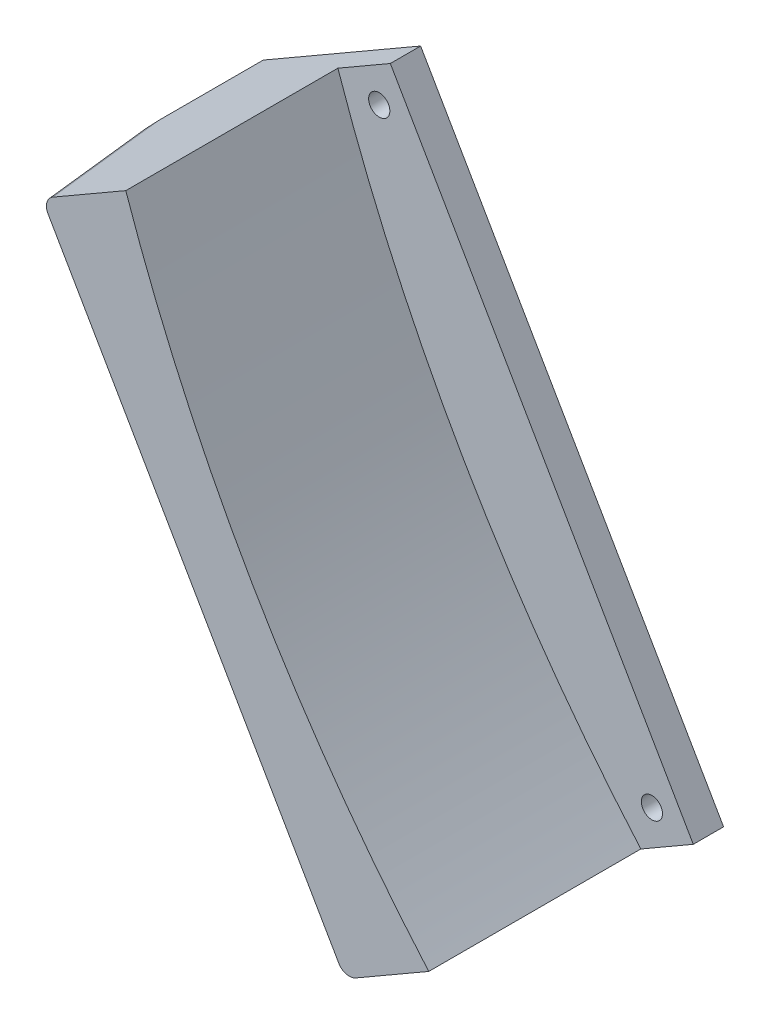
ISO-10303-21;
HEADER;
FILE_DESCRIPTION(('STEP AP214'),'2;1');
FILE_NAME('part.step','',(''),(''),'','','');
FILE_SCHEMA(('AUTOMOTIVE_DESIGN { 1 0 10303 214 1 1 1 1 }'));
ENDSEC;
DATA;
#1=APPLICATION_CONTEXT('core data for automotive mechanical design processes');
#2=APPLICATION_PROTOCOL_DEFINITION('international standard','automotive_design',2000,#1);
#3=PRODUCT_CONTEXT('',#1,'mechanical');
#4=PRODUCT('Part','Part','',(#3));
#5=PRODUCT_RELATED_PRODUCT_CATEGORY('part','',(#4));
#6=PRODUCT_DEFINITION_FORMATION('','',#4);
#7=PRODUCT_DEFINITION_CONTEXT('part definition',#1,'design');
#8=PRODUCT_DEFINITION('design','',#6,#7);
#9=PRODUCT_DEFINITION_SHAPE('','',#8);
#10=(LENGTH_UNIT() NAMED_UNIT(*) SI_UNIT(.MILLI.,.METRE.));
#11=(NAMED_UNIT(*) PLANE_ANGLE_UNIT() SI_UNIT($,.RADIAN.));
#12=(NAMED_UNIT(*) SI_UNIT($,.STERADIAN.) SOLID_ANGLE_UNIT());
#13=UNCERTAINTY_MEASURE_WITH_UNIT(LENGTH_MEASURE(1.E-05),#10,'distance_accuracy_value','');
#14=(GEOMETRIC_REPRESENTATION_CONTEXT(3) GLOBAL_UNCERTAINTY_ASSIGNED_CONTEXT((#13)) GLOBAL_UNIT_ASSIGNED_CONTEXT((#10,
#11,#12)) REPRESENTATION_CONTEXT('',''));
#15=CARTESIAN_POINT('',(0.,0.,0.));
#16=DIRECTION('',(0.,0.,1.));
#17=DIRECTION('',(1.,0.,0.));
#18=AXIS2_PLACEMENT_3D('',#15,#16,#17);
#19=CARTESIAN_POINT('',(124.70765814496,71.9999999999997,20.));
#20=DIRECTION('',(0.,0.,-1.));
#21=DIRECTION('',(-1.,0.,0.));
#22=AXIS2_PLACEMENT_3D('',#19,#20,#21);
#23=CYLINDRICAL_SURFACE('',#22,262.5);
#24=DIRECTION('',(0.,0.,-1.));
#25=VECTOR('',#24,1.);
#26=CARTESIAN_POINT('',(-73.4619802469967,-100.148320989783,20.));
#27=LINE('',#26,#25);
#28=CARTESIAN_POINT('',(-73.4619802469967,-100.148320989783,20.));
#29=VERTEX_POINT('',#28);
#30=CARTESIAN_POINT('',(-73.4619802469967,-100.148320989783,-15.));
#31=VERTEX_POINT('',#30);
#32=EDGE_CURVE('E209',#29,#31,#27,.T.);
#33=ORIENTED_EDGE('',*,*,#32,.T.);
#34=CARTESIAN_POINT('',(124.70765814496,71.9999999999997,-15.));
#35=DIRECTION('',(0.,0.,-1.));
#36=DIRECTION('',(-1.,0.,0.));
#37=AXIS2_PLACEMENT_3D('',#34,#35,#36);
#38=CIRCLE('',#37,262.5);
#39=CARTESIAN_POINT('',(-123.461980247008,-13.5457806113193,-15.));
#40=VERTEX_POINT('',#39);
#41=EDGE_CURVE('E170',#40,#31,#38,.F.);
#42=ORIENTED_EDGE('',*,*,#41,.F.);
#43=DIRECTION('',(0.,0.,-1.));
#44=VECTOR('',#43,1.);
#45=CARTESIAN_POINT('',(-123.461980247008,-13.5457806113193,20.));
#46=LINE('',#45,#44);
#47=CARTESIAN_POINT('',(-123.461980247008,-13.5457806113193,20.));
#48=VERTEX_POINT('',#47);
#49=EDGE_CURVE('E218',#48,#40,#46,.T.);
#50=ORIENTED_EDGE('',*,*,#49,.F.);
#51=CARTESIAN_POINT('',(124.70765814496,71.9999999999997,20.));
#52=DIRECTION('',(0.,0.,1.));
#53=DIRECTION('',(1.,0.,0.));
#54=AXIS2_PLACEMENT_3D('',#51,#52,#53);
#55=CIRCLE('',#54,262.5);
#56=EDGE_CURVE('E197',#48,#29,#55,.T.);
#57=ORIENTED_EDGE('',*,*,#56,.T.);
#58=EDGE_LOOP('',(#33,#42,#50,#57));
#59=FACE_BOUND('',#58,.T.);
#60=ADVANCED_FACE('F71',(#59),#23,.F.);
#61=CARTESIAN_POINT('',(-25.0000000000509,43.3012701892647,20.));
#62=DIRECTION('',(0.500000000000394,-0.866025403784211,0.));
#63=DIRECTION('',(0.866025403784211,0.500000000000394,0.));
#64=AXIS2_PLACEMENT_3D('',#61,#62,#63);
#65=PLANE('',#64);
#66=DIRECTION('',(0.,0.,-1.));
#67=VECTOR('',#66,1.);
#68=CARTESIAN_POINT('',(-140.782488322695,-23.5457806113285,20.));
#69=LINE('',#68,#67);
#70=CARTESIAN_POINT('',(-140.782488322695,-23.5457806113285,-2.72740661030927));
#71=VERTEX_POINT('',#70);
#72=CARTESIAN_POINT('',(-140.782488322695,-23.5457806113285,-20.));
#73=VERTEX_POINT('',#72);
#74=EDGE_CURVE('E215',#71,#73,#69,.T.);
#75=ORIENTED_EDGE('',*,*,#74,.F.);
#76=DIRECTION('',(0.224143868041953,0.129409522551361,0.965925826289069));
#77=VECTOR('',#76,1.);
#78=CARTESIAN_POINT('',(-135.628693601688,-20.5702358418041,19.4823619097952));
#79=LINE('',#78,#77);
#80=CARTESIAN_POINT('',(-135.508575264828,-20.5008854876831,20.));
#81=VERTEX_POINT('',#80);
#82=EDGE_CURVE('E228',#71,#81,#79,.T.);
#83=ORIENTED_EDGE('',*,*,#82,.T.);
#84=DIRECTION('',(-0.866025403784211,-0.500000000000394,0.));
#85=VECTOR('',#84,1.);
#86=CARTESIAN_POINT('',(-25.0000000000509,43.3012701892647,20.));
#87=LINE('',#86,#85);
#88=EDGE_CURVE('E201',#48,#81,#87,.T.);
#89=ORIENTED_EDGE('',*,*,#88,.F.);
#90=ORIENTED_EDGE('',*,*,#49,.T.);
#91=DIRECTION('',(0.866025403784211,0.500000000000394,0.));
#92=VECTOR('',#91,1.);
#93=CARTESIAN_POINT('',(-87.499943068542,7.21691123429726,-15.));
#94=LINE('',#93,#92);
#95=CARTESIAN_POINT('',(-114.801726209168,-8.54578061131624,-15.));
#96=VERTEX_POINT('',#95);
#97=EDGE_CURVE('E165',#40,#96,#94,.T.);
#98=ORIENTED_EDGE('',*,*,#97,.T.);
#99=DIRECTION('',(0.,0.,1.));
#100=VECTOR('',#99,1.);
#101=CARTESIAN_POINT('',(-114.801726209168,-8.54578061131624,-20.));
#102=LINE('',#101,#100);
#103=CARTESIAN_POINT('',(-114.801726209168,-8.54578061131624,-20.));
#104=VERTEX_POINT('',#103);
#105=EDGE_CURVE('E162',#104,#96,#102,.T.);
#106=ORIENTED_EDGE('',*,*,#105,.F.);
#107=DIRECTION('',(0.866025403784211,0.500000000000394,0.));
#108=VECTOR('',#107,1.);
#109=CARTESIAN_POINT('',(-87.499943068542,7.21691123429726,-20.));
#110=LINE('',#109,#108);
#111=EDGE_CURVE('E146',#73,#104,#110,.T.);
#112=ORIENTED_EDGE('',*,*,#111,.F.);
#113=EDGE_LOOP('',(#75,#83,#89,#90,#98,#106,#112));
#114=FACE_BOUND('',#113,.T.);
#115=ADVANCED_FACE('F163',(#114),#65,.F.);
#116=CARTESIAN_POINT('',(-115.782488322694,-66.8470508005519,20.));
#117=DIRECTION('',(0.866025403784439,0.5,0.));
#118=DIRECTION('',(-0.5,0.866025403784439,0.));
#119=AXIS2_PLACEMENT_3D('',#116,#117,#118);
#120=PLANE('',#119);
#121=DIRECTION('',(-0.5,0.866025403784439,0.));
#122=VECTOR('',#121,1.);
#123=CARTESIAN_POINT('',(-140.782488322695,-23.5457806113285,4.9999999999998));
#124=LINE('',#123,#122);
#125=CARTESIAN_POINT('',(-91.782488322694,-108.416270182205,4.9999999999998));
#126=VERTEX_POINT('',#125);
#127=CARTESIAN_POINT('',(-139.782488322695,-25.2778314188966,4.9999999999998));
#128=VERTEX_POINT('',#127);
#129=EDGE_CURVE('E225',#126,#128,#124,.T.);
#130=ORIENTED_EDGE('',*,*,#129,.T.);
#131=CARTESIAN_POINT('',(-139.782488322695,-25.2778314188974,-2.72740661031277));
#132=DIRECTION('',(0.866025403784439,0.5,0.));
#133=DIRECTION('',(0.,-1.05562035583231E-13,-1.));
#134=AXIS2_PLACEMENT_3D('',#131,#132,#133);
#135=ELLIPSE('',#134,7.72740661031261,2.);
#136=EDGE_CURVE('E80',#128,#71,#135,.F.);
#137=ORIENTED_EDGE('',*,*,#136,.T.);
#138=ORIENTED_EDGE('',*,*,#74,.T.);
#139=DIRECTION('',(-0.5,0.866025403784439,0.));
#140=VECTOR('',#139,1.);
#141=CARTESIAN_POINT('',(-115.928602318722,-66.5939739357341,-20.));
#142=LINE('',#141,#140);
#143=CARTESIAN_POINT('',(-90.7824883226946,-110.148320989772,-20.));
#144=VERTEX_POINT('',#143);
#145=EDGE_CURVE('E155',#144,#73,#142,.T.);
#146=ORIENTED_EDGE('',*,*,#145,.F.);
#147=DIRECTION('',(0.,0.,-1.));
#148=VECTOR('',#147,1.);
#149=CARTESIAN_POINT('',(-90.7824883226946,-110.148320989772,20.));
#150=LINE('',#149,#148);
#151=CARTESIAN_POINT('',(-90.7824883226946,-110.148320989772,-2.72740661030766));
#152=VERTEX_POINT('',#151);
#153=EDGE_CURVE('E212',#152,#144,#150,.T.);
#154=ORIENTED_EDGE('',*,*,#153,.F.);
#155=CARTESIAN_POINT('',(-91.7824883226946,-108.416270182203,-2.72740661031279));
#156=DIRECTION('',(0.866025403784439,0.5,0.));
#157=DIRECTION('',(0.,1.59139372360859E-13,-1.));
#158=AXIS2_PLACEMENT_3D('',#155,#156,#157);
#159=ELLIPSE('',#158,7.72740661031261,2.);
#160=EDGE_CURVE('E87',#152,#126,#159,.F.);
#161=ORIENTED_EDGE('',*,*,#160,.T.);
#162=EDGE_LOOP('',(#130,#137,#138,#146,#154,#161));
#163=FACE_BOUND('',#162,.T.);
#164=ADVANCED_FACE('F247',(#163),#120,.F.);
#165=CARTESIAN_POINT('',(25.0000000000153,-43.301270189317,20.));
#166=DIRECTION('',(0.499999999999406,-0.866025403784782,0.));
#167=DIRECTION('',(0.866025403784782,0.499999999999406,0.));
#168=AXIS2_PLACEMENT_3D('',#165,#166,#167);
#169=PLANE('',#168);
#170=DIRECTION('',(-0.866025403784782,-0.499999999999406,0.));
#171=VECTOR('',#170,1.);
#172=CARTESIAN_POINT('',(25.0000000000153,-43.301270189317,20.));
#173=LINE('',#172,#171);
#174=CARTESIAN_POINT('',(-85.5085752648245,-107.103425866133,20.));
#175=VERTEX_POINT('',#174);
#176=EDGE_CURVE('E205',#29,#175,#173,.T.);
#177=ORIENTED_EDGE('',*,*,#176,.T.);
#178=DIRECTION('',(-0.2241438680421,-0.129409522551106,-0.965925826289069));
#179=VECTOR('',#178,1.);
#180=CARTESIAN_POINT('',(-78.1059043900927,-102.829491843891,51.9010778384458));
#181=LINE('',#180,#179);
#182=EDGE_CURVE('E12',#175,#152,#181,.T.);
#183=ORIENTED_EDGE('',*,*,#182,.T.);
#184=ORIENTED_EDGE('',*,*,#153,.T.);
#185=DIRECTION('',(0.866025403784782,0.499999999999406,0.));
#186=VECTOR('',#185,1.);
#187=CARTESIAN_POINT('',(-37.4999430685172,-79.3856291442133,-20.));
#188=LINE('',#187,#186);
#189=CARTESIAN_POINT('',(-64.8017262091504,-95.1483209897897,-20.));
#190=VERTEX_POINT('',#189);
#191=EDGE_CURVE('E176',#144,#190,#188,.T.);
#192=ORIENTED_EDGE('',*,*,#191,.T.);
#193=DIRECTION('',(0.,0.,1.));
#194=VECTOR('',#193,1.);
#195=CARTESIAN_POINT('',(-64.8017262091504,-95.1483209897897,-20.));
#196=LINE('',#195,#194);
#197=CARTESIAN_POINT('',(-64.8017262091504,-95.1483209897897,-15.));
#198=VERTEX_POINT('',#197);
#199=EDGE_CURVE('E171',#190,#198,#196,.T.);
#200=ORIENTED_EDGE('',*,*,#199,.T.);
#201=DIRECTION('',(0.866025403784782,0.499999999999406,0.));
#202=VECTOR('',#201,1.);
#203=CARTESIAN_POINT('',(-37.4999430685172,-79.3856291442133,-15.));
#204=LINE('',#203,#202);
#205=EDGE_CURVE('E159',#31,#198,#204,.T.);
#206=ORIENTED_EDGE('',*,*,#205,.F.);
#207=ORIENTED_EDGE('',*,*,#32,.F.);
#208=EDGE_LOOP('',(#177,#183,#184,#192,#200,#206,#207));
#209=FACE_BOUND('',#208,.T.);
#210=ADVANCED_FACE('F259',(#209),#169,.T.);
#211=CARTESIAN_POINT('',(0.,0.,20.));
#212=DIRECTION('',(0.,0.,1.));
#213=DIRECTION('',(1.,0.,0.));
#214=AXIS2_PLACEMENT_3D('',#211,#212,#213);
#215=PLANE('',#214);
#216=ORIENTED_EDGE('',*,*,#88,.T.);
#217=CARTESIAN_POINT('',(-134.508575264827,-22.2329362952515,20.));
#218=DIRECTION('',(0.,0.,1.));
#219=DIRECTION('',(-0.866025403784211,-0.500000000000394,0.));
#220=AXIS2_PLACEMENT_3D('',#217,#218,#219);
#221=ELLIPSE('',#220,2.07055236082016,2.);
#222=CARTESIAN_POINT('',(-136.301726209163,-23.2682124756616,20.));
#223=VERTEX_POINT('',#222);
#224=EDGE_CURVE('E235',#81,#223,#221,.T.);
#225=ORIENTED_EDGE('',*,*,#224,.T.);
#226=DIRECTION('',(0.5,-0.866025403784439,0.));
#227=VECTOR('',#226,1.);
#228=CARTESIAN_POINT('',(-87.3017262091615,-108.138702046539,20.));
#229=LINE('',#228,#227);
#230=CARTESIAN_POINT('',(-88.3017262091594,-106.406651238974,20.));
#231=VERTEX_POINT('',#230);
#232=EDGE_CURVE('E221',#223,#231,#229,.T.);
#233=ORIENTED_EDGE('',*,*,#232,.T.);
#234=CARTESIAN_POINT('',(-86.5085752648233,-105.371375058564,20.));
#235=DIRECTION('',(0.,0.,1.));
#236=DIRECTION('',(-0.866025403784782,-0.499999999999406,0.));
#237=AXIS2_PLACEMENT_3D('',#234,#235,#236);
#238=ELLIPSE('',#237,2.07055236082016,2.);
#239=EDGE_CURVE('E232',#231,#175,#238,.T.);
#240=ORIENTED_EDGE('',*,*,#239,.T.);
#241=ORIENTED_EDGE('',*,*,#176,.F.);
#242=ORIENTED_EDGE('',*,*,#56,.F.);
#243=EDGE_LOOP('',(#216,#225,#233,#240,#241,#242));
#244=FACE_BOUND('',#243,.T.);
#245=ADVANCED_FACE('F253',(#244),#215,.T.);
#246=CARTESIAN_POINT('',(0.,0.,-15.));
#247=DIRECTION('',(0.,0.,1.));
#248=DIRECTION('',(0.,-1.,0.));
#249=AXIS2_PLACEMENT_3D('',#246,#247,#248);
#250=PLANE('',#249);
#251=CARTESIAN_POINT('',(-71.6318532280829,-93.3181939708497,-15.));
#252=DIRECTION('',(0.,0.,-1.));
#253=DIRECTION('',(-1.,0.,0.));
#254=AXIS2_PLACEMENT_3D('',#251,#252,#253);
#255=CIRCLE('',#254,1.75);
#256=CARTESIAN_POINT('',(-73.3818532280829,-93.3181939708497,-15.));
#257=VERTEX_POINT('',#256);
#258=EDGE_CURVE('E394',#257,#257,#255,.T.);
#259=ORIENTED_EDGE('',*,*,#258,.T.);
#260=EDGE_LOOP('',(#259));
#261=FACE_BOUND('',#260,.T.);
#262=CARTESIAN_POINT('',(-116.631853228082,-15.3759076302541,-15.));
#263=DIRECTION('',(0.,0.,-1.));
#264=DIRECTION('',(-1.,0.,0.));
#265=AXIS2_PLACEMENT_3D('',#262,#263,#264);
#266=CIRCLE('',#265,1.75000000000004);
#267=CARTESIAN_POINT('',(-118.381853228082,-15.3759076302541,-15.));
#268=VERTEX_POINT('',#267);
#269=EDGE_CURVE('E401',#268,#268,#266,.T.);
#270=ORIENTED_EDGE('',*,*,#269,.T.);
#271=EDGE_LOOP('',(#270));
#272=FACE_BOUND('',#271,.T.);
#273=ORIENTED_EDGE('',*,*,#97,.F.);
#274=ORIENTED_EDGE('',*,*,#41,.T.);
#275=ORIENTED_EDGE('',*,*,#205,.T.);
#276=DIRECTION('',(-0.5,0.866025403784439,0.));
#277=VECTOR('',#276,1.);
#278=CARTESIAN_POINT('',(-89.9478402051881,-51.5939739357336,-15.));
#279=LINE('',#278,#277);
#280=EDGE_CURVE('E186',#198,#96,#279,.T.);
#281=ORIENTED_EDGE('',*,*,#280,.T.);
#282=EDGE_LOOP('',(#273,#274,#275,#281));
#283=FACE_BOUND('',#282,.T.);
#284=ADVANCED_FACE('F265',(#261,#272,#283),#250,.T.);
#285=CARTESIAN_POINT('',(0.,0.,-20.));
#286=DIRECTION('',(0.,0.,1.));
#287=DIRECTION('',(0.,-1.,0.));
#288=AXIS2_PLACEMENT_3D('',#285,#286,#287);
#289=PLANE('',#288);
#290=ORIENTED_EDGE('',*,*,#111,.T.);
#291=DIRECTION('',(-0.5,0.866025403784439,0.));
#292=VECTOR('',#291,1.);
#293=CARTESIAN_POINT('',(-89.9478402051881,-51.5939739357336,-20.));
#294=LINE('',#293,#292);
#295=EDGE_CURVE('E152',#190,#104,#294,.T.);
#296=ORIENTED_EDGE('',*,*,#295,.F.);
#297=ORIENTED_EDGE('',*,*,#191,.F.);
#298=ORIENTED_EDGE('',*,*,#145,.T.);
#299=EDGE_LOOP('',(#290,#296,#297,#298));
#300=FACE_BOUND('',#299,.T.);
#301=CARTESIAN_POINT('',(-71.6318532280829,-93.3181939708497,-20.));
#302=DIRECTION('',(0.,0.,-1.));
#303=DIRECTION('',(-1.,0.,0.));
#304=AXIS2_PLACEMENT_3D('',#301,#302,#303);
#305=CIRCLE('',#304,1.75);
#306=CARTESIAN_POINT('',(-73.3818532280829,-93.3181939708497,-20.));
#307=VERTEX_POINT('',#306);
#308=EDGE_CURVE('E187',#307,#307,#305,.T.);
#309=ORIENTED_EDGE('',*,*,#308,.F.);
#310=EDGE_LOOP('',(#309));
#311=FACE_BOUND('',#310,.T.);
#312=CARTESIAN_POINT('',(-116.631853228082,-15.3759076302541,-20.));
#313=DIRECTION('',(0.,0.,-1.));
#314=DIRECTION('',(-1.,0.,0.));
#315=AXIS2_PLACEMENT_3D('',#312,#313,#314);
#316=CIRCLE('',#315,1.75000000000004);
#317=CARTESIAN_POINT('',(-118.381853228082,-15.3759076302541,-20.));
#318=VERTEX_POINT('',#317);
#319=EDGE_CURVE('E396',#318,#318,#316,.T.);
#320=ORIENTED_EDGE('',*,*,#319,.F.);
#321=EDGE_LOOP('',(#320));
#322=FACE_BOUND('',#321,.T.);
#323=ADVANCED_FACE('F148',(#300,#311,#322),#289,.F.);
#324=CARTESIAN_POINT('',(-89.9478402051881,-51.5939739357336,-20.));
#325=DIRECTION('',(0.866025403784438,0.5,0.));
#326=DIRECTION('',(-0.5,0.866025403784439,0.));
#327=AXIS2_PLACEMENT_3D('',#324,#325,#326);
#328=PLANE('',#327);
#329=ORIENTED_EDGE('',*,*,#280,.F.);
#330=ORIENTED_EDGE('',*,*,#199,.F.);
#331=ORIENTED_EDGE('',*,*,#295,.T.);
#332=ORIENTED_EDGE('',*,*,#105,.T.);
#333=EDGE_LOOP('',(#329,#330,#331,#332));
#334=FACE_BOUND('',#333,.T.);
#335=ADVANCED_FACE('F173',(#334),#328,.T.);
#336=CARTESIAN_POINT('',(-71.6318532280829,-93.3181939708497,-20.));
#337=DIRECTION('',(0.,0.,1.));
#338=DIRECTION('',(1.,0.,0.));
#339=AXIS2_PLACEMENT_3D('',#336,#337,#338);
#340=CYLINDRICAL_SURFACE('',#339,1.75);
#341=ORIENTED_EDGE('',*,*,#308,.T.);
#342=EDGE_LOOP('',(#341));
#343=FACE_BOUND('',#342,.T.);
#344=ORIENTED_EDGE('',*,*,#258,.F.);
#345=EDGE_LOOP('',(#344));
#346=FACE_BOUND('',#345,.T.);
#347=ADVANCED_FACE('F344',(#343,#346),#340,.F.);
#348=CARTESIAN_POINT('',(-116.631853228082,-15.3759076302541,-20.));
#349=DIRECTION('',(0.,0.,1.));
#350=DIRECTION('',(1.,0.,0.));
#351=AXIS2_PLACEMENT_3D('',#348,#349,#350);
#352=CYLINDRICAL_SURFACE('',#351,1.75000000000004);
#353=ORIENTED_EDGE('',*,*,#319,.T.);
#354=EDGE_LOOP('',(#353));
#355=FACE_BOUND('',#354,.T.);
#356=ORIENTED_EDGE('',*,*,#269,.F.);
#357=EDGE_LOOP('',(#356));
#358=FACE_BOUND('',#357,.T.);
#359=ADVANCED_FACE('F287',(#355,#358),#352,.F.);
#360=CARTESIAN_POINT('',(-112.301726209161,-64.8374318573185,20.));
#361=DIRECTION('',(-0.836516303737808,-0.482962913144534,0.258819045102519));
#362=DIRECTION('',(-0.5,0.866025403784439,0.));
#363=AXIS2_PLACEMENT_3D('',#360,#361,#362);
#364=PLANE('',#363);
#365=ORIENTED_EDGE('',*,*,#232,.F.);
#366=DIRECTION('',(0.224143868041953,0.129409522551361,0.965925826289069));
#367=VECTOR('',#366,1.);
#368=CARTESIAN_POINT('',(-139.782488322695,-25.2778314188966,5.00000000000003));
#369=LINE('',#368,#367);
#370=EDGE_CURVE('E94',#223,#128,#369,.F.);
#371=ORIENTED_EDGE('',*,*,#370,.T.);
#372=ORIENTED_EDGE('',*,*,#129,.F.);
#373=DIRECTION('',(-0.2241438680421,-0.129409522551106,-0.965925826289069));
#374=VECTOR('',#373,1.);
#375=CARTESIAN_POINT('',(-88.3017262091613,-106.406651238975,19.9999999999918));
#376=LINE('',#375,#374);
#377=EDGE_CURVE('E238',#126,#231,#376,.F.);
#378=ORIENTED_EDGE('',*,*,#377,.T.);
#379=EDGE_LOOP('',(#365,#371,#372,#378));
#380=FACE_BOUND('',#379,.T.);
#381=ADVANCED_FACE('F256',(#380),#364,.T.);
#382=CARTESIAN_POINT('',(-127.105904390099,-17.9590022730008,51.9010778384485));
#383=DIRECTION('',(-0.224143868041953,-0.129409522551361,-0.965925826289069));
#384=DIRECTION('',(-0.974116947696311,0.,0.226044624379397));
#385=AXIS2_PLACEMENT_3D('',#382,#383,#384);
#386=CYLINDRICAL_SURFACE('',#385,2.);
#387=ORIENTED_EDGE('',*,*,#136,.F.);
#388=ORIENTED_EDGE('',*,*,#370,.F.);
#389=ORIENTED_EDGE('',*,*,#224,.F.);
#390=ORIENTED_EDGE('',*,*,#82,.F.);
#391=EDGE_LOOP('',(#387,#388,#389,#390));
#392=FACE_BOUND('',#391,.T.);
#393=ADVANCED_FACE('F251',(#392),#386,.T.);
#394=CARTESIAN_POINT('',(-79.1059043900915,-101.097441036322,51.9010778384457));
#395=DIRECTION('',(-0.2241438680421,-0.129409522551106,-0.965925826289069));
#396=DIRECTION('',(-0.974116947696278,0.,0.226044624379539));
#397=AXIS2_PLACEMENT_3D('',#394,#395,#396);
#398=CYLINDRICAL_SURFACE('',#397,2.);
#399=ORIENTED_EDGE('',*,*,#239,.F.);
#400=ORIENTED_EDGE('',*,*,#377,.F.);
#401=ORIENTED_EDGE('',*,*,#160,.F.);
#402=ORIENTED_EDGE('',*,*,#182,.F.);
#403=EDGE_LOOP('',(#399,#400,#401,#402));
#404=FACE_BOUND('',#403,.T.);
#405=ADVANCED_FACE('F73',(#404),#398,.T.);
#406=CLOSED_SHELL('',(#60,#115,#164,#210,#245,#284,#323,#335,#347,#359,#381,#393,#405));
#407=MANIFOLD_SOLID_BREP('B2',#406);
#408=ADVANCED_BREP_SHAPE_REPRESENTATION('',(#18,#407),#14);
#409=SHAPE_DEFINITION_REPRESENTATION(#9,#408);
ENDSEC;
END-ISO-10303-21;
